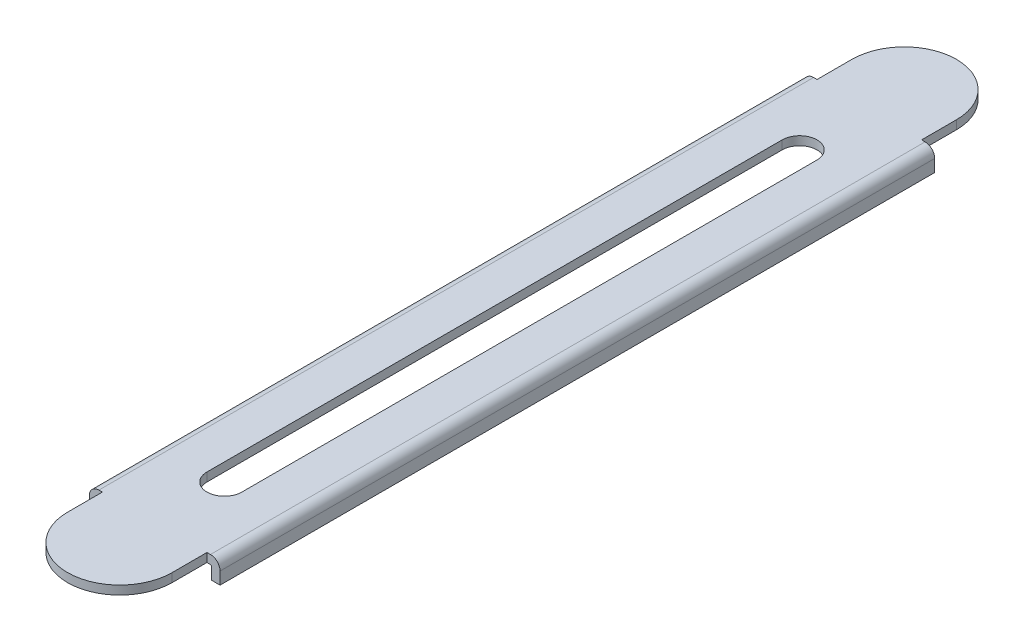
ISO-10303-21;
HEADER;
FILE_DESCRIPTION(('STEP AP214'),'2;1');
FILE_NAME('part.step','',(''),(''),'','','');
FILE_SCHEMA(('AUTOMOTIVE_DESIGN { 1 0 10303 214 1 1 1 1 }'));
ENDSEC;
DATA;
#1=APPLICATION_CONTEXT('core data for automotive mechanical design processes');
#2=APPLICATION_PROTOCOL_DEFINITION('international standard','automotive_design',2000,#1);
#3=PRODUCT_CONTEXT('',#1,'mechanical');
#4=PRODUCT('Part','Part','',(#3));
#5=PRODUCT_RELATED_PRODUCT_CATEGORY('part','',(#4));
#6=PRODUCT_DEFINITION_FORMATION('','',#4);
#7=PRODUCT_DEFINITION_CONTEXT('part definition',#1,'design');
#8=PRODUCT_DEFINITION('design','',#6,#7);
#9=PRODUCT_DEFINITION_SHAPE('','',#8);
#10=(LENGTH_UNIT() NAMED_UNIT(*) SI_UNIT(.MILLI.,.METRE.));
#11=(NAMED_UNIT(*) PLANE_ANGLE_UNIT() SI_UNIT($,.RADIAN.));
#12=(NAMED_UNIT(*) SI_UNIT($,.STERADIAN.) SOLID_ANGLE_UNIT());
#13=UNCERTAINTY_MEASURE_WITH_UNIT(LENGTH_MEASURE(1.E-05),#10,'distance_accuracy_value','');
#14=(GEOMETRIC_REPRESENTATION_CONTEXT(3) GLOBAL_UNCERTAINTY_ASSIGNED_CONTEXT((#13)) GLOBAL_UNIT_ASSIGNED_CONTEXT((#10,
#11,#12)) REPRESENTATION_CONTEXT('',''));
#15=CARTESIAN_POINT('',(0.,0.,0.));
#16=DIRECTION('',(0.,0.,1.));
#17=DIRECTION('',(1.,0.,0.));
#18=AXIS2_PLACEMENT_3D('',#15,#16,#17);
#19=CARTESIAN_POINT('',(14.,44.7424171068503,-96.));
#20=DIRECTION('',(0.,-1.,0.));
#21=DIRECTION('',(0.,0.,-1.));
#22=AXIS2_PLACEMENT_3D('',#19,#20,#21);
#23=PLANE('',#22);
#24=CARTESIAN_POINT('',(14.,44.7424171068503,-84.));
#25=DIRECTION('',(0.,-1.,0.));
#26=DIRECTION('',(0.,0.,-1.));
#27=AXIS2_PLACEMENT_3D('',#24,#25,#26);
#28=CIRCLE('',#27,2.);
#29=CARTESIAN_POINT('',(12.,44.7424171068503,-84.));
#30=VERTEX_POINT('',#29);
#31=CARTESIAN_POINT('',(16.,44.7424171068503,-84.));
#32=VERTEX_POINT('',#31);
#33=EDGE_CURVE('E234',#30,#32,#28,.T.);
#34=ORIENTED_EDGE('',*,*,#33,.F.);
#35=DIRECTION('',(0.,0.,-1.));
#36=VECTOR('',#35,1.);
#37=CARTESIAN_POINT('',(12.,44.7424171068503,-96.));
#38=LINE('',#37,#36);
#39=CARTESIAN_POINT('',(12.,44.7424171068503,-18.));
#40=VERTEX_POINT('',#39);
#41=EDGE_CURVE('E227',#40,#30,#38,.T.);
#42=ORIENTED_EDGE('',*,*,#41,.F.);
#43=CARTESIAN_POINT('',(14.,44.7424171068503,-18.));
#44=DIRECTION('',(0.,-1.,0.));
#45=DIRECTION('',(0.,0.,-1.));
#46=AXIS2_PLACEMENT_3D('',#43,#44,#45);
#47=CIRCLE('',#46,2.);
#48=CARTESIAN_POINT('',(16.,44.7424171068503,-18.));
#49=VERTEX_POINT('',#48);
#50=EDGE_CURVE('E202',#49,#40,#47,.T.);
#51=ORIENTED_EDGE('',*,*,#50,.F.);
#52=DIRECTION('',(0.,0.,1.));
#53=VECTOR('',#52,1.);
#54=CARTESIAN_POINT('',(16.,44.7424171068503,-96.));
#55=LINE('',#54,#53);
#56=EDGE_CURVE('E232',#32,#49,#55,.T.);
#57=ORIENTED_EDGE('',*,*,#56,.F.);
#58=EDGE_LOOP('',(#34,#42,#51,#57));
#59=FACE_BOUND('',#58,.T.);
#60=DIRECTION('',(1.,0.,0.));
#61=VECTOR('',#60,1.);
#62=CARTESIAN_POINT('',(6.5,44.7424171068503,-10.));
#63=LINE('',#62,#61);
#64=CARTESIAN_POINT('',(7.6,44.7424171068503,-10.));
#65=VERTEX_POINT('',#64);
#66=CARTESIAN_POINT('',(8.,44.7424171068503,-10.));
#67=VERTEX_POINT('',#66);
#68=EDGE_CURVE('E270',#65,#67,#63,.T.);
#69=ORIENTED_EDGE('',*,*,#68,.F.);
#70=DIRECTION('',(0.,0.,1.));
#71=VECTOR('',#70,1.);
#72=CARTESIAN_POINT('',(7.6,44.7424171068503,-96.));
#73=LINE('',#72,#71);
#74=CARTESIAN_POINT('',(7.6,44.7424171068503,-92.));
#75=VERTEX_POINT('',#74);
#76=EDGE_CURVE('E349',#65,#75,#73,.F.);
#77=ORIENTED_EDGE('',*,*,#76,.T.);
#78=DIRECTION('',(1.,0.,0.));
#79=VECTOR('',#78,1.);
#80=CARTESIAN_POINT('',(6.5,44.7424171068503,-92.));
#81=LINE('',#80,#79);
#82=CARTESIAN_POINT('',(8.,44.7424171068503,-92.));
#83=VERTEX_POINT('',#82);
#84=EDGE_CURVE('E260',#75,#83,#81,.T.);
#85=ORIENTED_EDGE('',*,*,#84,.T.);
#86=DIRECTION('',(0.,0.,-1.));
#87=VECTOR('',#86,1.);
#88=CARTESIAN_POINT('',(8.,44.7424171068503,-6.));
#89=LINE('',#88,#87);
#90=CARTESIAN_POINT('',(8.,44.7424171068503,-96.));
#91=VERTEX_POINT('',#90);
#92=EDGE_CURVE('E332',#83,#91,#89,.T.);
#93=ORIENTED_EDGE('',*,*,#92,.T.);
#94=CARTESIAN_POINT('',(14.,44.7424171068503,-96.));
#95=DIRECTION('',(0.,-1.,0.));
#96=DIRECTION('',(0.,0.,-1.));
#97=AXIS2_PLACEMENT_3D('',#94,#95,#96);
#98=CIRCLE('',#97,6.);
#99=CARTESIAN_POINT('',(20.,44.7424171068503,-96.));
#100=VERTEX_POINT('',#99);
#101=EDGE_CURVE('E306',#91,#100,#98,.T.);
#102=ORIENTED_EDGE('',*,*,#101,.T.);
#103=DIRECTION('',(0.,0.,1.));
#104=VECTOR('',#103,1.);
#105=CARTESIAN_POINT('',(20.,44.7424171068503,-96.));
#106=LINE('',#105,#104);
#107=CARTESIAN_POINT('',(20.,44.7424171068503,-92.));
#108=VERTEX_POINT('',#107);
#109=EDGE_CURVE('E326',#100,#108,#106,.T.);
#110=ORIENTED_EDGE('',*,*,#109,.T.);
#111=DIRECTION('',(-1.,0.,0.));
#112=VECTOR('',#111,1.);
#113=CARTESIAN_POINT('',(21.5,44.7424171068503,-92.));
#114=LINE('',#113,#112);
#115=CARTESIAN_POINT('',(20.4,44.7424171068503,-92.));
#116=VERTEX_POINT('',#115);
#117=EDGE_CURVE('E304',#116,#108,#114,.T.);
#118=ORIENTED_EDGE('',*,*,#117,.F.);
#119=DIRECTION('',(0.,0.,-1.));
#120=VECTOR('',#119,1.);
#121=CARTESIAN_POINT('',(20.4,44.7424171068503,-96.));
#122=LINE('',#121,#120);
#123=CARTESIAN_POINT('',(20.4,44.7424171068503,-10.));
#124=VERTEX_POINT('',#123);
#125=EDGE_CURVE('E347',#116,#124,#122,.F.);
#126=ORIENTED_EDGE('',*,*,#125,.T.);
#127=DIRECTION('',(-1.,0.,0.));
#128=VECTOR('',#127,1.);
#129=CARTESIAN_POINT('',(21.5,44.7424171068503,-10.));
#130=LINE('',#129,#128);
#131=CARTESIAN_POINT('',(20.,44.7424171068503,-10.));
#132=VERTEX_POINT('',#131);
#133=EDGE_CURVE('E294',#124,#132,#130,.T.);
#134=ORIENTED_EDGE('',*,*,#133,.T.);
#135=CARTESIAN_POINT('',(20.,44.7424171068503,-6.));
#136=VERTEX_POINT('',#135);
#137=EDGE_CURVE('E325',#132,#136,#106,.T.);
#138=ORIENTED_EDGE('',*,*,#137,.T.);
#139=CARTESIAN_POINT('',(14.,44.7424171068503,-6.));
#140=DIRECTION('',(0.,-1.,0.));
#141=DIRECTION('',(0.,0.,-1.));
#142=AXIS2_PLACEMENT_3D('',#139,#140,#141);
#143=CIRCLE('',#142,6.);
#144=CARTESIAN_POINT('',(8.,44.7424171068503,-6.));
#145=VERTEX_POINT('',#144);
#146=EDGE_CURVE('E329',#136,#145,#143,.T.);
#147=ORIENTED_EDGE('',*,*,#146,.T.);
#148=EDGE_CURVE('E311',#145,#67,#89,.T.);
#149=ORIENTED_EDGE('',*,*,#148,.T.);
#150=EDGE_LOOP('',(#69,#77,#85,#93,#102,#110,#118,#126,#134,#138,#147,#149));
#151=FACE_BOUND('',#150,.T.);
#152=ADVANCED_FACE('F34',(#59,#151),#23,.T.);
#153=CARTESIAN_POINT('',(8.,45.7424171068503,-6.));
#154=DIRECTION('',(-1.,0.,0.));
#155=DIRECTION('',(0.,0.,1.));
#156=AXIS2_PLACEMENT_3D('',#153,#154,#155);
#157=PLANE('',#156);
#158=DIRECTION('',(0.,0.,-1.));
#159=VECTOR('',#158,1.);
#160=CARTESIAN_POINT('',(8.,45.7424171068503,-6.));
#161=LINE('',#160,#159);
#162=CARTESIAN_POINT('',(8.,45.7424171068503,-6.));
#163=VERTEX_POINT('',#162);
#164=CARTESIAN_POINT('',(8.,45.7424171068503,-10.));
#165=VERTEX_POINT('',#164);
#166=EDGE_CURVE('E319',#163,#165,#161,.T.);
#167=ORIENTED_EDGE('',*,*,#166,.T.);
#168=DIRECTION('',(0.,1.,0.));
#169=VECTOR('',#168,1.);
#170=CARTESIAN_POINT('',(8.,45.7424171068503,-10.));
#171=LINE('',#170,#169);
#172=EDGE_CURVE('E253',#67,#165,#171,.T.);
#173=ORIENTED_EDGE('',*,*,#172,.F.);
#174=ORIENTED_EDGE('',*,*,#148,.F.);
#175=DIRECTION('',(0.,-1.,0.));
#176=VECTOR('',#175,1.);
#177=CARTESIAN_POINT('',(8.,45.7424171068503,-6.));
#178=LINE('',#177,#176);
#179=EDGE_CURVE('E339',#163,#145,#178,.T.);
#180=ORIENTED_EDGE('',*,*,#179,.F.);
#181=EDGE_LOOP('',(#167,#173,#174,#180));
#182=FACE_BOUND('',#181,.T.);
#183=ADVANCED_FACE('F416',(#182),#157,.T.);
#184=ORIENTED_EDGE('',*,*,#92,.F.);
#185=DIRECTION('',(0.,-1.,0.));
#186=VECTOR('',#185,1.);
#187=CARTESIAN_POINT('',(8.,44.7424171068503,-92.));
#188=LINE('',#187,#186);
#189=CARTESIAN_POINT('',(8.,45.7424171068503,-92.));
#190=VERTEX_POINT('',#189);
#191=EDGE_CURVE('E258',#190,#83,#188,.T.);
#192=ORIENTED_EDGE('',*,*,#191,.F.);
#193=CARTESIAN_POINT('',(8.,45.7424171068503,-96.));
#194=VERTEX_POINT('',#193);
#195=EDGE_CURVE('E318',#190,#194,#161,.T.);
#196=ORIENTED_EDGE('',*,*,#195,.T.);
#197=DIRECTION('',(0.,-1.,0.));
#198=VECTOR('',#197,1.);
#199=CARTESIAN_POINT('',(8.,45.7424171068503,-96.));
#200=LINE('',#199,#198);
#201=EDGE_CURVE('E335',#194,#91,#200,.T.);
#202=ORIENTED_EDGE('',*,*,#201,.T.);
#203=EDGE_LOOP('',(#184,#192,#196,#202));
#204=FACE_BOUND('',#203,.T.);
#205=ADVANCED_FACE('F461',(#204),#157,.T.);
#206=CARTESIAN_POINT('',(20.,45.7424171068503,-96.));
#207=DIRECTION('',(1.,0.,0.));
#208=DIRECTION('',(0.,0.,-1.));
#209=AXIS2_PLACEMENT_3D('',#206,#207,#208);
#210=PLANE('',#209);
#211=DIRECTION('',(0.,0.,1.));
#212=VECTOR('',#211,1.);
#213=CARTESIAN_POINT('',(20.,45.7424171068503,-96.));
#214=LINE('',#213,#212);
#215=CARTESIAN_POINT('',(20.,45.7424171068503,-96.));
#216=VERTEX_POINT('',#215);
#217=CARTESIAN_POINT('',(20.,45.7424171068503,-92.));
#218=VERTEX_POINT('',#217);
#219=EDGE_CURVE('E312',#216,#218,#214,.T.);
#220=ORIENTED_EDGE('',*,*,#219,.T.);
#221=DIRECTION('',(0.,1.,0.));
#222=VECTOR('',#221,1.);
#223=CARTESIAN_POINT('',(20.,45.7424171068503,-92.));
#224=LINE('',#223,#222);
#225=EDGE_CURVE('E288',#108,#218,#224,.T.);
#226=ORIENTED_EDGE('',*,*,#225,.F.);
#227=ORIENTED_EDGE('',*,*,#109,.F.);
#228=DIRECTION('',(0.,-1.,0.));
#229=VECTOR('',#228,1.);
#230=CARTESIAN_POINT('',(20.,45.7424171068503,-96.));
#231=LINE('',#230,#229);
#232=EDGE_CURVE('E322',#216,#100,#231,.T.);
#233=ORIENTED_EDGE('',*,*,#232,.F.);
#234=EDGE_LOOP('',(#220,#226,#227,#233));
#235=FACE_BOUND('',#234,.T.);
#236=ADVANCED_FACE('F470',(#235),#210,.T.);
#237=ORIENTED_EDGE('',*,*,#137,.F.);
#238=DIRECTION('',(0.,-1.,0.));
#239=VECTOR('',#238,1.);
#240=CARTESIAN_POINT('',(20.,44.7424171068503,-10.));
#241=LINE('',#240,#239);
#242=CARTESIAN_POINT('',(20.,45.7424171068503,-10.));
#243=VERTEX_POINT('',#242);
#244=EDGE_CURVE('E292',#243,#132,#241,.T.);
#245=ORIENTED_EDGE('',*,*,#244,.F.);
#246=CARTESIAN_POINT('',(20.,45.7424171068503,-6.));
#247=VERTEX_POINT('',#246);
#248=EDGE_CURVE('E310',#243,#247,#214,.T.);
#249=ORIENTED_EDGE('',*,*,#248,.T.);
#250=DIRECTION('',(0.,-1.,0.));
#251=VECTOR('',#250,1.);
#252=CARTESIAN_POINT('',(20.,45.7424171068503,-6.));
#253=LINE('',#252,#251);
#254=EDGE_CURVE('E341',#247,#136,#253,.T.);
#255=ORIENTED_EDGE('',*,*,#254,.T.);
#256=EDGE_LOOP('',(#237,#245,#249,#255));
#257=FACE_BOUND('',#256,.T.);
#258=ADVANCED_FACE('F411',(#257),#210,.T.);
#259=CARTESIAN_POINT('',(14.,45.7424171068503,-96.));
#260=DIRECTION('',(0.,-1.,0.));
#261=DIRECTION('',(0.,0.,-1.));
#262=AXIS2_PLACEMENT_3D('',#259,#260,#261);
#263=CYLINDRICAL_SURFACE('',#262,6.);
#264=ORIENTED_EDGE('',*,*,#101,.F.);
#265=ORIENTED_EDGE('',*,*,#201,.F.);
#266=CARTESIAN_POINT('',(14.,45.7424171068503,-96.));
#267=DIRECTION('',(0.,-1.,0.));
#268=DIRECTION('',(0.,0.,-1.));
#269=AXIS2_PLACEMENT_3D('',#266,#267,#268);
#270=CIRCLE('',#269,6.);
#271=EDGE_CURVE('E307',#194,#216,#270,.T.);
#272=ORIENTED_EDGE('',*,*,#271,.T.);
#273=ORIENTED_EDGE('',*,*,#232,.T.);
#274=EDGE_LOOP('',(#264,#265,#272,#273));
#275=FACE_BOUND('',#274,.T.);
#276=ADVANCED_FACE('F469',(#275),#263,.T.);
#277=CARTESIAN_POINT('',(14.,45.7424171068503,-6.));
#278=DIRECTION('',(0.,-1.,0.));
#279=DIRECTION('',(0.,0.,-1.));
#280=AXIS2_PLACEMENT_3D('',#277,#278,#279);
#281=CYLINDRICAL_SURFACE('',#280,6.);
#282=ORIENTED_EDGE('',*,*,#146,.F.);
#283=ORIENTED_EDGE('',*,*,#254,.F.);
#284=CARTESIAN_POINT('',(14.,45.7424171068503,-6.));
#285=DIRECTION('',(0.,-1.,0.));
#286=DIRECTION('',(0.,0.,-1.));
#287=AXIS2_PLACEMENT_3D('',#284,#285,#286);
#288=CIRCLE('',#287,6.);
#289=EDGE_CURVE('E315',#247,#163,#288,.T.);
#290=ORIENTED_EDGE('',*,*,#289,.T.);
#291=ORIENTED_EDGE('',*,*,#179,.T.);
#292=EDGE_LOOP('',(#282,#283,#290,#291));
#293=FACE_BOUND('',#292,.T.);
#294=ADVANCED_FACE('F413',(#293),#281,.T.);
#295=CARTESIAN_POINT('',(14.,45.7424171068503,-96.));
#296=DIRECTION('',(0.,-1.,0.));
#297=DIRECTION('',(0.,0.,-1.));
#298=AXIS2_PLACEMENT_3D('',#295,#296,#297);
#299=PLANE('',#298);
#300=DIRECTION('',(0.,0.,1.));
#301=VECTOR('',#300,1.);
#302=CARTESIAN_POINT('',(12.,45.7424171068503,-84.));
#303=LINE('',#302,#301);
#304=CARTESIAN_POINT('',(12.,45.7424171068503,-84.));
#305=VERTEX_POINT('',#304);
#306=CARTESIAN_POINT('',(12.,45.7424171068503,-18.));
#307=VERTEX_POINT('',#306);
#308=EDGE_CURVE('E210',#305,#307,#303,.T.);
#309=ORIENTED_EDGE('',*,*,#308,.F.);
#310=CARTESIAN_POINT('',(14.,45.7424171068503,-84.));
#311=DIRECTION('',(0.,1.,0.));
#312=DIRECTION('',(0.,0.,1.));
#313=AXIS2_PLACEMENT_3D('',#310,#311,#312);
#314=CIRCLE('',#313,2.);
#315=CARTESIAN_POINT('',(16.,45.7424171068503,-84.));
#316=VERTEX_POINT('',#315);
#317=EDGE_CURVE('E215',#316,#305,#314,.T.);
#318=ORIENTED_EDGE('',*,*,#317,.F.);
#319=DIRECTION('',(0.,0.,-1.));
#320=VECTOR('',#319,1.);
#321=CARTESIAN_POINT('',(16.,45.7424171068503,-18.));
#322=LINE('',#321,#320);
#323=CARTESIAN_POINT('',(16.,45.7424171068503,-18.));
#324=VERTEX_POINT('',#323);
#325=EDGE_CURVE('E220',#324,#316,#322,.T.);
#326=ORIENTED_EDGE('',*,*,#325,.F.);
#327=CARTESIAN_POINT('',(14.,45.7424171068503,-18.));
#328=DIRECTION('',(0.,1.,0.));
#329=DIRECTION('',(0.,0.,1.));
#330=AXIS2_PLACEMENT_3D('',#327,#328,#329);
#331=CIRCLE('',#330,2.);
#332=EDGE_CURVE('E199',#307,#324,#331,.T.);
#333=ORIENTED_EDGE('',*,*,#332,.F.);
#334=EDGE_LOOP('',(#309,#318,#326,#333));
#335=FACE_BOUND('',#334,.T.);
#336=DIRECTION('',(1.,0.,0.));
#337=VECTOR('',#336,1.);
#338=CARTESIAN_POINT('',(6.5,45.7424171068503,-92.));
#339=LINE('',#338,#337);
#340=CARTESIAN_POINT('',(7.6,45.7424171068503,-92.));
#341=VERTEX_POINT('',#340);
#342=EDGE_CURVE('E266',#341,#190,#339,.T.);
#343=ORIENTED_EDGE('',*,*,#342,.F.);
#344=DIRECTION('',(0.,0.,-1.));
#345=VECTOR('',#344,1.);
#346=CARTESIAN_POINT('',(7.6,45.7424171068503,-96.));
#347=LINE('',#346,#345);
#348=CARTESIAN_POINT('',(7.6,45.7424171068503,-10.));
#349=VERTEX_POINT('',#348);
#350=EDGE_CURVE('E369',#341,#349,#347,.F.);
#351=ORIENTED_EDGE('',*,*,#350,.T.);
#352=DIRECTION('',(1.,0.,0.));
#353=VECTOR('',#352,1.);
#354=CARTESIAN_POINT('',(6.5,45.7424171068503,-10.));
#355=LINE('',#354,#353);
#356=EDGE_CURVE('E268',#349,#165,#355,.T.);
#357=ORIENTED_EDGE('',*,*,#356,.T.);
#358=ORIENTED_EDGE('',*,*,#166,.F.);
#359=ORIENTED_EDGE('',*,*,#289,.F.);
#360=ORIENTED_EDGE('',*,*,#248,.F.);
#361=DIRECTION('',(-1.,0.,0.));
#362=VECTOR('',#361,1.);
#363=CARTESIAN_POINT('',(21.5,45.7424171068503,-10.));
#364=LINE('',#363,#362);
#365=CARTESIAN_POINT('',(20.4,45.7424171068503,-10.));
#366=VERTEX_POINT('',#365);
#367=EDGE_CURVE('E300',#366,#243,#364,.T.);
#368=ORIENTED_EDGE('',*,*,#367,.F.);
#369=DIRECTION('',(0.,0.,1.));
#370=VECTOR('',#369,1.);
#371=CARTESIAN_POINT('',(20.4,45.7424171068503,-96.));
#372=LINE('',#371,#370);
#373=CARTESIAN_POINT('',(20.4,45.7424171068503,-92.));
#374=VERTEX_POINT('',#373);
#375=EDGE_CURVE('E367',#366,#374,#372,.F.);
#376=ORIENTED_EDGE('',*,*,#375,.T.);
#377=DIRECTION('',(-1.,0.,0.));
#378=VECTOR('',#377,1.);
#379=CARTESIAN_POINT('',(21.5,45.7424171068503,-92.));
#380=LINE('',#379,#378);
#381=EDGE_CURVE('E302',#374,#218,#380,.T.);
#382=ORIENTED_EDGE('',*,*,#381,.T.);
#383=ORIENTED_EDGE('',*,*,#219,.F.);
#384=ORIENTED_EDGE('',*,*,#271,.F.);
#385=ORIENTED_EDGE('',*,*,#195,.F.);
#386=EDGE_LOOP('',(#343,#351,#357,#358,#359,#360,#368,#376,#382,#383,#384,#385));
#387=FACE_BOUND('',#386,.T.);
#388=ADVANCED_FACE('F217',(#335,#387),#299,.F.);
#389=CARTESIAN_POINT('',(21.5,45.7424171068503,-92.));
#390=DIRECTION('',(0.,0.,1.));
#391=DIRECTION('',(1.,0.,0.));
#392=AXIS2_PLACEMENT_3D('',#389,#390,#391);
#393=PLANE('',#392);
#394=ORIENTED_EDGE('',*,*,#381,.F.);
#395=CARTESIAN_POINT('',(20.4,44.6424171068503,-92.));
#396=DIRECTION('',(0.,0.,1.));
#397=DIRECTION('',(1.,0.,0.));
#398=AXIS2_PLACEMENT_3D('',#395,#396,#397);
#399=CIRCLE('',#398,1.1);
#400=CARTESIAN_POINT('',(21.5,44.6424171068503,-92.));
#401=VERTEX_POINT('',#400);
#402=EDGE_CURVE('E11',#374,#401,#399,.F.);
#403=ORIENTED_EDGE('',*,*,#402,.T.);
#404=DIRECTION('',(0.,1.,0.));
#405=VECTOR('',#404,1.);
#406=CARTESIAN_POINT('',(21.5,45.7424171068503,-92.));
#407=LINE('',#406,#405);
#408=CARTESIAN_POINT('',(21.5,43.2424171068503,-92.));
#409=VERTEX_POINT('',#408);
#410=EDGE_CURVE('E289',#409,#401,#407,.T.);
#411=ORIENTED_EDGE('',*,*,#410,.F.);
#412=DIRECTION('',(1.,0.,0.));
#413=VECTOR('',#412,1.);
#414=CARTESIAN_POINT('',(21.5,43.2424171068503,-92.));
#415=LINE('',#414,#413);
#416=CARTESIAN_POINT('',(20.5,43.2424171068503,-92.));
#417=VERTEX_POINT('',#416);
#418=EDGE_CURVE('E279',#417,#409,#415,.T.);
#419=ORIENTED_EDGE('',*,*,#418,.F.);
#420=DIRECTION('',(0.,1.,0.));
#421=VECTOR('',#420,1.);
#422=CARTESIAN_POINT('',(20.5,43.2424171068503,-92.));
#423=LINE('',#422,#421);
#424=CARTESIAN_POINT('',(20.5,44.6424171068503,-92.));
#425=VERTEX_POINT('',#424);
#426=EDGE_CURVE('E282',#417,#425,#423,.T.);
#427=ORIENTED_EDGE('',*,*,#426,.T.);
#428=CARTESIAN_POINT('',(20.4,44.6424171068503,-92.));
#429=DIRECTION('',(0.,0.,1.));
#430=DIRECTION('',(1.,0.,0.));
#431=AXIS2_PLACEMENT_3D('',#428,#429,#430);
#432=CIRCLE('',#431,0.100000000000003);
#433=EDGE_CURVE('E358',#425,#116,#432,.T.);
#434=ORIENTED_EDGE('',*,*,#433,.T.);
#435=ORIENTED_EDGE('',*,*,#117,.T.);
#436=ORIENTED_EDGE('',*,*,#225,.T.);
#437=EDGE_LOOP('',(#394,#403,#411,#419,#427,#434,#435,#436));
#438=FACE_BOUND('',#437,.T.);
#439=ADVANCED_FACE('F387',(#438),#393,.F.);
#440=CARTESIAN_POINT('',(21.5,44.7424171068503,-10.));
#441=DIRECTION('',(0.,0.,-1.));
#442=DIRECTION('',(0.,1.,0.));
#443=AXIS2_PLACEMENT_3D('',#440,#441,#442);
#444=PLANE('',#443);
#445=DIRECTION('',(0.,-1.,0.));
#446=VECTOR('',#445,1.);
#447=CARTESIAN_POINT('',(21.5,44.7424171068503,-10.));
#448=LINE('',#447,#446);
#449=CARTESIAN_POINT('',(21.5,44.6424171068503,-10.));
#450=VERTEX_POINT('',#449);
#451=CARTESIAN_POINT('',(21.5,43.2424171068503,-10.));
#452=VERTEX_POINT('',#451);
#453=EDGE_CURVE('E291',#450,#452,#448,.T.);
#454=ORIENTED_EDGE('',*,*,#453,.F.);
#455=CARTESIAN_POINT('',(20.4,44.6424171068503,-10.));
#456=DIRECTION('',(0.,0.,-1.));
#457=DIRECTION('',(0.,1.,0.));
#458=AXIS2_PLACEMENT_3D('',#455,#456,#457);
#459=CIRCLE('',#458,1.1);
#460=EDGE_CURVE('E42',#450,#366,#459,.F.);
#461=ORIENTED_EDGE('',*,*,#460,.T.);
#462=ORIENTED_EDGE('',*,*,#367,.T.);
#463=ORIENTED_EDGE('',*,*,#244,.T.);
#464=ORIENTED_EDGE('',*,*,#133,.F.);
#465=CARTESIAN_POINT('',(20.4,44.6424171068503,-9.99999999999999));
#466=DIRECTION('',(0.,0.,-1.));
#467=DIRECTION('',(0.,1.,0.));
#468=AXIS2_PLACEMENT_3D('',#465,#466,#467);
#469=CIRCLE('',#468,0.100000000000003);
#470=CARTESIAN_POINT('',(20.5,44.6424171068503,-10.));
#471=VERTEX_POINT('',#470);
#472=EDGE_CURVE('E360',#124,#471,#469,.T.);
#473=ORIENTED_EDGE('',*,*,#472,.T.);
#474=DIRECTION('',(0.,1.,0.));
#475=VECTOR('',#474,1.);
#476=CARTESIAN_POINT('',(20.5,43.2424171068503,-10.));
#477=LINE('',#476,#475);
#478=CARTESIAN_POINT('',(20.5,43.2424171068503,-10.));
#479=VERTEX_POINT('',#478);
#480=EDGE_CURVE('E285',#479,#471,#477,.T.);
#481=ORIENTED_EDGE('',*,*,#480,.F.);
#482=DIRECTION('',(-1.,0.,0.));
#483=VECTOR('',#482,1.);
#484=CARTESIAN_POINT('',(20.5,43.2424171068503,-10.));
#485=LINE('',#484,#483);
#486=EDGE_CURVE('E275',#452,#479,#485,.T.);
#487=ORIENTED_EDGE('',*,*,#486,.F.);
#488=EDGE_LOOP('',(#454,#461,#462,#463,#464,#473,#481,#487));
#489=FACE_BOUND('',#488,.T.);
#490=ADVANCED_FACE('F377',(#489),#444,.F.);
#491=CARTESIAN_POINT('',(21.5,0.,0.));
#492=DIRECTION('',(-1.,0.,0.));
#493=DIRECTION('',(0.,0.,1.));
#494=AXIS2_PLACEMENT_3D('',#491,#492,#493);
#495=PLANE('',#494);
#496=ORIENTED_EDGE('',*,*,#410,.T.);
#497=DIRECTION('',(0.,0.,1.));
#498=VECTOR('',#497,1.);
#499=CARTESIAN_POINT('',(21.5,44.6424171068503,0.));
#500=LINE('',#499,#498);
#501=EDGE_CURVE('E373',#401,#450,#500,.T.);
#502=ORIENTED_EDGE('',*,*,#501,.T.);
#503=ORIENTED_EDGE('',*,*,#453,.T.);
#504=DIRECTION('',(0.,0.,1.));
#505=VECTOR('',#504,1.);
#506=CARTESIAN_POINT('',(21.5,43.2424171068503,-10.));
#507=LINE('',#506,#505);
#508=EDGE_CURVE('E272',#409,#452,#507,.T.);
#509=ORIENTED_EDGE('',*,*,#508,.F.);
#510=EDGE_LOOP('',(#496,#502,#503,#509));
#511=FACE_BOUND('',#510,.T.);
#512=ADVANCED_FACE('F384',(#511),#495,.F.);
#513=CARTESIAN_POINT('',(20.5,43.2424171068503,-92.));
#514=DIRECTION('',(1.,0.,0.));
#515=DIRECTION('',(0.,0.,-1.));
#516=AXIS2_PLACEMENT_3D('',#513,#514,#515);
#517=PLANE('',#516);
#518=ORIENTED_EDGE('',*,*,#480,.T.);
#519=DIRECTION('',(0.,0.,-1.));
#520=VECTOR('',#519,1.);
#521=CARTESIAN_POINT('',(20.5,44.6424171068503,-92.));
#522=LINE('',#521,#520);
#523=EDGE_CURVE('E351',#471,#425,#522,.T.);
#524=ORIENTED_EDGE('',*,*,#523,.T.);
#525=ORIENTED_EDGE('',*,*,#426,.F.);
#526=DIRECTION('',(0.,0.,-1.));
#527=VECTOR('',#526,1.);
#528=CARTESIAN_POINT('',(20.5,43.2424171068503,-92.));
#529=LINE('',#528,#527);
#530=EDGE_CURVE('E277',#479,#417,#529,.T.);
#531=ORIENTED_EDGE('',*,*,#530,.F.);
#532=EDGE_LOOP('',(#518,#524,#525,#531));
#533=FACE_BOUND('',#532,.T.);
#534=ADVANCED_FACE('F394',(#533),#517,.F.);
#535=CARTESIAN_POINT('',(0.,43.2424171068503,0.));
#536=DIRECTION('',(0.,1.,0.));
#537=DIRECTION('',(0.,0.,1.));
#538=AXIS2_PLACEMENT_3D('',#535,#536,#537);
#539=PLANE('',#538);
#540=ORIENTED_EDGE('',*,*,#508,.T.);
#541=ORIENTED_EDGE('',*,*,#486,.T.);
#542=ORIENTED_EDGE('',*,*,#530,.T.);
#543=ORIENTED_EDGE('',*,*,#418,.T.);
#544=EDGE_LOOP('',(#540,#541,#542,#543));
#545=FACE_BOUND('',#544,.T.);
#546=ADVANCED_FACE('F389',(#545),#539,.F.);
#547=CARTESIAN_POINT('',(6.5,45.7424171068503,-10.));
#548=DIRECTION('',(0.,0.,-1.));
#549=DIRECTION('',(0.,1.,0.));
#550=AXIS2_PLACEMENT_3D('',#547,#548,#549);
#551=PLANE('',#550);
#552=ORIENTED_EDGE('',*,*,#356,.F.);
#553=CARTESIAN_POINT('',(7.6,44.6424171068503,-10.));
#554=DIRECTION('',(0.,0.,-1.));
#555=DIRECTION('',(0.,1.,0.));
#556=AXIS2_PLACEMENT_3D('',#553,#554,#555);
#557=CIRCLE('',#556,1.1);
#558=CARTESIAN_POINT('',(6.5,44.6424171068503,-10.));
#559=VERTEX_POINT('',#558);
#560=EDGE_CURVE('E371',#349,#559,#557,.F.);
#561=ORIENTED_EDGE('',*,*,#560,.T.);
#562=DIRECTION('',(0.,1.,0.));
#563=VECTOR('',#562,1.);
#564=CARTESIAN_POINT('',(6.5,45.7424171068503,-10.));
#565=LINE('',#564,#563);
#566=CARTESIAN_POINT('',(6.5,43.2424171068503,-10.));
#567=VERTEX_POINT('',#566);
#568=EDGE_CURVE('E254',#567,#559,#565,.T.);
#569=ORIENTED_EDGE('',*,*,#568,.F.);
#570=DIRECTION('',(-1.,0.,0.));
#571=VECTOR('',#570,1.);
#572=CARTESIAN_POINT('',(6.5,43.2424171068503,-10.));
#573=LINE('',#572,#571);
#574=CARTESIAN_POINT('',(7.5,43.2424171068503,-10.));
#575=VERTEX_POINT('',#574);
#576=EDGE_CURVE('E239',#575,#567,#573,.T.);
#577=ORIENTED_EDGE('',*,*,#576,.F.);
#578=DIRECTION('',(0.,1.,0.));
#579=VECTOR('',#578,1.);
#580=CARTESIAN_POINT('',(7.5,43.2424171068503,-10.));
#581=LINE('',#580,#579);
#582=CARTESIAN_POINT('',(7.5,44.6424171068503,-10.));
#583=VERTEX_POINT('',#582);
#584=EDGE_CURVE('E250',#575,#583,#581,.T.);
#585=ORIENTED_EDGE('',*,*,#584,.T.);
#586=CARTESIAN_POINT('',(7.6,44.6424171068503,-10.));
#587=DIRECTION('',(0.,0.,-1.));
#588=DIRECTION('',(0.,1.,0.));
#589=AXIS2_PLACEMENT_3D('',#586,#587,#588);
#590=CIRCLE('',#589,0.100000000000003);
#591=EDGE_CURVE('E354',#583,#65,#590,.T.);
#592=ORIENTED_EDGE('',*,*,#591,.T.);
#593=ORIENTED_EDGE('',*,*,#68,.T.);
#594=ORIENTED_EDGE('',*,*,#172,.T.);
#595=EDGE_LOOP('',(#552,#561,#569,#577,#585,#592,#593,#594));
#596=FACE_BOUND('',#595,.T.);
#597=ADVANCED_FACE('F446',(#596),#551,.F.);
#598=CARTESIAN_POINT('',(6.5,44.7424171068503,-92.));
#599=DIRECTION('',(0.,0.,1.));
#600=DIRECTION('',(1.,0.,0.));
#601=AXIS2_PLACEMENT_3D('',#598,#599,#600);
#602=PLANE('',#601);
#603=DIRECTION('',(0.,-1.,0.));
#604=VECTOR('',#603,1.);
#605=CARTESIAN_POINT('',(6.5,44.7424171068503,-92.));
#606=LINE('',#605,#604);
#607=CARTESIAN_POINT('',(6.5,44.6424171068503,-92.));
#608=VERTEX_POINT('',#607);
#609=CARTESIAN_POINT('',(6.5,43.2424171068503,-92.));
#610=VERTEX_POINT('',#609);
#611=EDGE_CURVE('E257',#608,#610,#606,.T.);
#612=ORIENTED_EDGE('',*,*,#611,.F.);
#613=CARTESIAN_POINT('',(7.6,44.6424171068503,-92.));
#614=DIRECTION('',(0.,0.,1.));
#615=DIRECTION('',(1.,0.,0.));
#616=AXIS2_PLACEMENT_3D('',#613,#614,#615);
#617=CIRCLE('',#616,1.1);
#618=EDGE_CURVE('E365',#608,#341,#617,.F.);
#619=ORIENTED_EDGE('',*,*,#618,.T.);
#620=ORIENTED_EDGE('',*,*,#342,.T.);
#621=ORIENTED_EDGE('',*,*,#191,.T.);
#622=ORIENTED_EDGE('',*,*,#84,.F.);
#623=CARTESIAN_POINT('',(7.6,44.6424171068503,-92.));
#624=DIRECTION('',(0.,0.,1.));
#625=DIRECTION('',(1.,0.,0.));
#626=AXIS2_PLACEMENT_3D('',#623,#624,#625);
#627=CIRCLE('',#626,0.100000000000003);
#628=CARTESIAN_POINT('',(7.5,44.6424171068503,-92.));
#629=VERTEX_POINT('',#628);
#630=EDGE_CURVE('E356',#75,#629,#627,.T.);
#631=ORIENTED_EDGE('',*,*,#630,.T.);
#632=DIRECTION('',(0.,1.,0.));
#633=VECTOR('',#632,1.);
#634=CARTESIAN_POINT('',(7.5,43.2424171068503,-92.));
#635=LINE('',#634,#633);
#636=CARTESIAN_POINT('',(7.5,43.2424171068503,-92.));
#637=VERTEX_POINT('',#636);
#638=EDGE_CURVE('E247',#637,#629,#635,.T.);
#639=ORIENTED_EDGE('',*,*,#638,.F.);
#640=DIRECTION('',(1.,0.,0.));
#641=VECTOR('',#640,1.);
#642=CARTESIAN_POINT('',(7.5,43.2424171068503,-92.));
#643=LINE('',#642,#641);
#644=EDGE_CURVE('E245',#610,#637,#643,.T.);
#645=ORIENTED_EDGE('',*,*,#644,.F.);
#646=EDGE_LOOP('',(#612,#619,#620,#621,#622,#631,#639,#645));
#647=FACE_BOUND('',#646,.T.);
#648=ADVANCED_FACE('F428',(#647),#602,.F.);
#649=CARTESIAN_POINT('',(6.5,0.,0.));
#650=DIRECTION('',(1.,0.,0.));
#651=DIRECTION('',(0.,0.,-1.));
#652=AXIS2_PLACEMENT_3D('',#649,#650,#651);
#653=PLANE('',#652);
#654=ORIENTED_EDGE('',*,*,#568,.T.);
#655=DIRECTION('',(0.,0.,-1.));
#656=VECTOR('',#655,1.);
#657=CARTESIAN_POINT('',(6.5,44.6424171068503,0.));
#658=LINE('',#657,#656);
#659=EDGE_CURVE('E362',#559,#608,#658,.T.);
#660=ORIENTED_EDGE('',*,*,#659,.T.);
#661=ORIENTED_EDGE('',*,*,#611,.T.);
#662=DIRECTION('',(0.,0.,-1.));
#663=VECTOR('',#662,1.);
#664=CARTESIAN_POINT('',(6.5,43.2424171068503,-92.));
#665=LINE('',#664,#663);
#666=EDGE_CURVE('E242',#567,#610,#665,.T.);
#667=ORIENTED_EDGE('',*,*,#666,.F.);
#668=EDGE_LOOP('',(#654,#660,#661,#667));
#669=FACE_BOUND('',#668,.T.);
#670=ADVANCED_FACE('F438',(#669),#653,.F.);
#671=CARTESIAN_POINT('',(7.5,43.2424171068503,-10.));
#672=DIRECTION('',(-1.,0.,0.));
#673=DIRECTION('',(0.,0.,1.));
#674=AXIS2_PLACEMENT_3D('',#671,#672,#673);
#675=PLANE('',#674);
#676=ORIENTED_EDGE('',*,*,#638,.T.);
#677=DIRECTION('',(0.,0.,1.));
#678=VECTOR('',#677,1.);
#679=CARTESIAN_POINT('',(7.5,44.6424171068503,-10.));
#680=LINE('',#679,#678);
#681=EDGE_CURVE('E338',#629,#583,#680,.T.);
#682=ORIENTED_EDGE('',*,*,#681,.T.);
#683=ORIENTED_EDGE('',*,*,#584,.F.);
#684=DIRECTION('',(0.,0.,1.));
#685=VECTOR('',#684,1.);
#686=CARTESIAN_POINT('',(7.5,43.2424171068503,-10.));
#687=LINE('',#686,#685);
#688=EDGE_CURVE('E236',#637,#575,#687,.T.);
#689=ORIENTED_EDGE('',*,*,#688,.F.);
#690=EDGE_LOOP('',(#676,#682,#683,#689));
#691=FACE_BOUND('',#690,.T.);
#692=ADVANCED_FACE('F432',(#691),#675,.F.);
#693=CARTESIAN_POINT('',(0.,43.2424171068503,0.));
#694=DIRECTION('',(0.,1.,0.));
#695=DIRECTION('',(0.,0.,1.));
#696=AXIS2_PLACEMENT_3D('',#693,#694,#695);
#697=PLANE('',#696);
#698=ORIENTED_EDGE('',*,*,#688,.T.);
#699=ORIENTED_EDGE('',*,*,#576,.T.);
#700=ORIENTED_EDGE('',*,*,#666,.T.);
#701=ORIENTED_EDGE('',*,*,#644,.T.);
#702=EDGE_LOOP('',(#698,#699,#700,#701));
#703=FACE_BOUND('',#702,.T.);
#704=ADVANCED_FACE('F435',(#703),#697,.F.);
#705=CARTESIAN_POINT('',(14.,43.2424171068503,-84.));
#706=DIRECTION('',(0.,1.,0.));
#707=DIRECTION('',(0.,0.,1.));
#708=AXIS2_PLACEMENT_3D('',#705,#706,#707);
#709=CYLINDRICAL_SURFACE('',#708,2.);
#710=ORIENTED_EDGE('',*,*,#33,.T.);
#711=DIRECTION('',(0.,1.,0.));
#712=VECTOR('',#711,1.);
#713=CARTESIAN_POINT('',(16.,43.2424171068503,-84.));
#714=LINE('',#713,#712);
#715=EDGE_CURVE('E225',#32,#316,#714,.T.);
#716=ORIENTED_EDGE('',*,*,#715,.T.);
#717=ORIENTED_EDGE('',*,*,#317,.T.);
#718=DIRECTION('',(0.,1.,0.));
#719=VECTOR('',#718,1.);
#720=CARTESIAN_POINT('',(12.,43.2424171068503,-84.));
#721=LINE('',#720,#719);
#722=EDGE_CURVE('E206',#30,#305,#721,.T.);
#723=ORIENTED_EDGE('',*,*,#722,.F.);
#724=EDGE_LOOP('',(#710,#716,#717,#723));
#725=FACE_BOUND('',#724,.T.);
#726=ADVANCED_FACE('F608',(#725),#709,.F.);
#727=CARTESIAN_POINT('',(16.,43.2424171068503,-18.));
#728=DIRECTION('',(1.,0.,0.));
#729=DIRECTION('',(0.,0.,-1.));
#730=AXIS2_PLACEMENT_3D('',#727,#728,#729);
#731=PLANE('',#730);
#732=ORIENTED_EDGE('',*,*,#56,.T.);
#733=DIRECTION('',(0.,1.,0.));
#734=VECTOR('',#733,1.);
#735=CARTESIAN_POINT('',(16.,43.2424171068503,-18.));
#736=LINE('',#735,#734);
#737=EDGE_CURVE('E205',#49,#324,#736,.T.);
#738=ORIENTED_EDGE('',*,*,#737,.T.);
#739=ORIENTED_EDGE('',*,*,#325,.T.);
#740=ORIENTED_EDGE('',*,*,#715,.F.);
#741=EDGE_LOOP('',(#732,#738,#739,#740));
#742=FACE_BOUND('',#741,.T.);
#743=ADVANCED_FACE('F599',(#742),#731,.F.);
#744=CARTESIAN_POINT('',(14.,43.2424171068503,-18.));
#745=DIRECTION('',(0.,1.,0.));
#746=DIRECTION('',(0.,0.,1.));
#747=AXIS2_PLACEMENT_3D('',#744,#745,#746);
#748=CYLINDRICAL_SURFACE('',#747,2.);
#749=ORIENTED_EDGE('',*,*,#50,.T.);
#750=DIRECTION('',(0.,1.,0.));
#751=VECTOR('',#750,1.);
#752=CARTESIAN_POINT('',(12.,43.2424171068503,-18.));
#753=LINE('',#752,#751);
#754=EDGE_CURVE('E194',#40,#307,#753,.T.);
#755=ORIENTED_EDGE('',*,*,#754,.T.);
#756=ORIENTED_EDGE('',*,*,#332,.T.);
#757=ORIENTED_EDGE('',*,*,#737,.F.);
#758=EDGE_LOOP('',(#749,#755,#756,#757));
#759=FACE_BOUND('',#758,.T.);
#760=ADVANCED_FACE('F196',(#759),#748,.F.);
#761=CARTESIAN_POINT('',(12.,43.2424171068503,-84.));
#762=DIRECTION('',(-1.,0.,0.));
#763=DIRECTION('',(0.,0.,1.));
#764=AXIS2_PLACEMENT_3D('',#761,#762,#763);
#765=PLANE('',#764);
#766=ORIENTED_EDGE('',*,*,#41,.T.);
#767=ORIENTED_EDGE('',*,*,#722,.T.);
#768=ORIENTED_EDGE('',*,*,#308,.T.);
#769=ORIENTED_EDGE('',*,*,#754,.F.);
#770=EDGE_LOOP('',(#766,#767,#768,#769));
#771=FACE_BOUND('',#770,.T.);
#772=ADVANCED_FACE('F211',(#771),#765,.F.);
#773=CARTESIAN_POINT('',(7.6,44.6424171068503,-10.));
#774=DIRECTION('',(0.,0.,1.));
#775=DIRECTION('',(1.,0.,0.));
#776=AXIS2_PLACEMENT_3D('',#773,#774,#775);
#777=CYLINDRICAL_SURFACE('',#776,0.100000000000003);
#778=ORIENTED_EDGE('',*,*,#630,.F.);
#779=ORIENTED_EDGE('',*,*,#76,.F.);
#780=ORIENTED_EDGE('',*,*,#591,.F.);
#781=ORIENTED_EDGE('',*,*,#681,.F.);
#782=EDGE_LOOP('',(#778,#779,#780,#781));
#783=FACE_BOUND('',#782,.T.);
#784=ADVANCED_FACE('F423',(#783),#777,.F.);
#785=CARTESIAN_POINT('',(20.4,44.6424171068503,-92.));
#786=DIRECTION('',(0.,0.,-1.));
#787=DIRECTION('',(-1.,0.,0.));
#788=AXIS2_PLACEMENT_3D('',#785,#786,#787);
#789=CYLINDRICAL_SURFACE('',#788,0.100000000000003);
#790=ORIENTED_EDGE('',*,*,#472,.F.);
#791=ORIENTED_EDGE('',*,*,#125,.F.);
#792=ORIENTED_EDGE('',*,*,#433,.F.);
#793=ORIENTED_EDGE('',*,*,#523,.F.);
#794=EDGE_LOOP('',(#790,#791,#792,#793));
#795=FACE_BOUND('',#794,.T.);
#796=ADVANCED_FACE('F405',(#795),#789,.F.);
#797=CARTESIAN_POINT('',(7.6,44.6424171068503,0.));
#798=DIRECTION('',(0.,0.,-1.));
#799=DIRECTION('',(-1.,0.,0.));
#800=AXIS2_PLACEMENT_3D('',#797,#798,#799);
#801=CYLINDRICAL_SURFACE('',#800,1.1);
#802=ORIENTED_EDGE('',*,*,#560,.F.);
#803=ORIENTED_EDGE('',*,*,#350,.F.);
#804=ORIENTED_EDGE('',*,*,#618,.F.);
#805=ORIENTED_EDGE('',*,*,#659,.F.);
#806=EDGE_LOOP('',(#802,#803,#804,#805));
#807=FACE_BOUND('',#806,.T.);
#808=ADVANCED_FACE('F442',(#807),#801,.T.);
#809=CARTESIAN_POINT('',(20.4,44.6424171068503,0.));
#810=DIRECTION('',(0.,0.,1.));
#811=DIRECTION('',(1.,0.,0.));
#812=AXIS2_PLACEMENT_3D('',#809,#810,#811);
#813=CYLINDRICAL_SURFACE('',#812,1.1);
#814=ORIENTED_EDGE('',*,*,#402,.F.);
#815=ORIENTED_EDGE('',*,*,#375,.F.);
#816=ORIENTED_EDGE('',*,*,#460,.F.);
#817=ORIENTED_EDGE('',*,*,#501,.F.);
#818=EDGE_LOOP('',(#814,#815,#816,#817));
#819=FACE_BOUND('',#818,.T.);
#820=ADVANCED_FACE('F36',(#819),#813,.T.);
#821=CLOSED_SHELL('',(#152,#183,#205,#236,#258,#276,#294,#388,#439,#490,#512,#534,#546,#597,
#648,#670,#692,#704,#726,#743,#760,#772,#784,#796,#808,#820));
#822=MANIFOLD_SOLID_BREP('B2',#821);
#823=ADVANCED_BREP_SHAPE_REPRESENTATION('',(#18,#822),#14);
#824=SHAPE_DEFINITION_REPRESENTATION(#9,#823);
ENDSEC;
END-ISO-10303-21;
